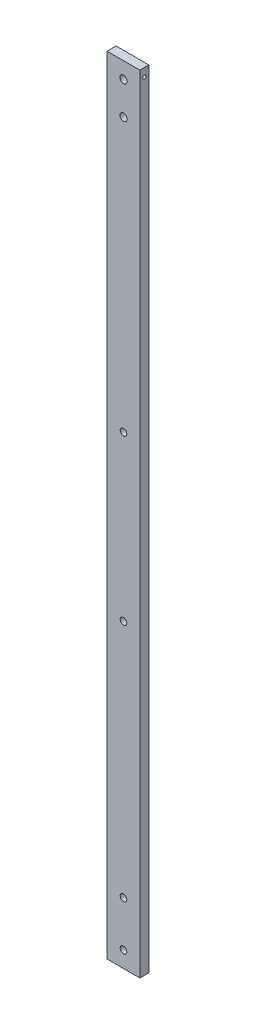
ISO-10303-21;
HEADER;
FILE_DESCRIPTION(('STEP AP214'),'2;1');
FILE_NAME('part.step','',(''),(''),'','','');
FILE_SCHEMA(('AUTOMOTIVE_DESIGN { 1 0 10303 214 1 1 1 1 }'));
ENDSEC;
DATA;
#1=APPLICATION_CONTEXT('core data for automotive mechanical design processes');
#2=APPLICATION_PROTOCOL_DEFINITION('international standard','automotive_design',2000,#1);
#3=PRODUCT_CONTEXT('',#1,'mechanical');
#4=PRODUCT('Part','Part','',(#3));
#5=PRODUCT_RELATED_PRODUCT_CATEGORY('part','',(#4));
#6=PRODUCT_DEFINITION_FORMATION('','',#4);
#7=PRODUCT_DEFINITION_CONTEXT('part definition',#1,'design');
#8=PRODUCT_DEFINITION('design','',#6,#7);
#9=PRODUCT_DEFINITION_SHAPE('','',#8);
#10=(LENGTH_UNIT() NAMED_UNIT(*) SI_UNIT(.MILLI.,.METRE.));
#11=(NAMED_UNIT(*) PLANE_ANGLE_UNIT() SI_UNIT($,.RADIAN.));
#12=(NAMED_UNIT(*) SI_UNIT($,.STERADIAN.) SOLID_ANGLE_UNIT());
#13=UNCERTAINTY_MEASURE_WITH_UNIT(LENGTH_MEASURE(1.E-05),#10,'distance_accuracy_value','');
#14=(GEOMETRIC_REPRESENTATION_CONTEXT(3) GLOBAL_UNCERTAINTY_ASSIGNED_CONTEXT((#13)) GLOBAL_UNIT_ASSIGNED_CONTEXT((#10,
#11,#12)) REPRESENTATION_CONTEXT('',''));
#15=CARTESIAN_POINT('',(0.,0.,0.));
#16=DIRECTION('',(0.,0.,1.));
#17=DIRECTION('',(1.,0.,0.));
#18=AXIS2_PLACEMENT_3D('',#15,#16,#17);
#19=CARTESIAN_POINT('',(0.,0.,7.));
#20=DIRECTION('',(0.,0.,-1.));
#21=DIRECTION('',(-1.,0.,0.));
#22=AXIS2_PLACEMENT_3D('',#19,#20,#21);
#23=PLANE('',#22);
#24=CARTESIAN_POINT('',(0.,55.4,7.));
#25=DIRECTION('',(0.,0.,-1.));
#26=DIRECTION('',(-1.,0.,0.));
#27=AXIS2_PLACEMENT_3D('',#24,#25,#26);
#28=CIRCLE('',#27,2.5527);
#29=CARTESIAN_POINT('',(-2.55270000000003,55.4,7.));
#30=VERTEX_POINT('',#29);
#31=EDGE_CURVE('E148',#30,#30,#28,.T.);
#32=ORIENTED_EDGE('',*,*,#31,.T.);
#33=EDGE_LOOP('',(#32));
#34=FACE_BOUND('',#33,.T.);
#35=CARTESIAN_POINT('',(0.,-71.6,7.));
#36=DIRECTION('',(0.,0.,-1.));
#37=DIRECTION('',(-1.,0.,0.));
#38=AXIS2_PLACEMENT_3D('',#35,#36,#37);
#39=CIRCLE('',#38,2.55270000000001);
#40=CARTESIAN_POINT('',(-2.55270000000001,-71.6,7.));
#41=VERTEX_POINT('',#40);
#42=EDGE_CURVE('E151',#41,#41,#39,.T.);
#43=ORIENTED_EDGE('',*,*,#42,.T.);
#44=EDGE_LOOP('',(#43));
#45=FACE_BOUND('',#44,.T.);
#46=DIRECTION('',(0.,1.,0.));
#47=VECTOR('',#46,1.);
#48=CARTESIAN_POINT('',(12.7000000000002,-304.800000000001,7.));
#49=LINE('',#48,#47);
#50=CARTESIAN_POINT('',(12.7000000000002,-304.800000000001,7.));
#51=VERTEX_POINT('',#50);
#52=CARTESIAN_POINT('',(12.7,304.799999999999,7.));
#53=VERTEX_POINT('',#52);
#54=EDGE_CURVE('E94',#51,#53,#49,.T.);
#55=ORIENTED_EDGE('',*,*,#54,.T.);
#56=DIRECTION('',(-1.,0.,0.));
#57=VECTOR('',#56,1.);
#58=CARTESIAN_POINT('',(-12.7,304.799999999999,7.));
#59=LINE('',#58,#57);
#60=CARTESIAN_POINT('',(-12.7,304.799999999999,7.));
#61=VERTEX_POINT('',#60);
#62=EDGE_CURVE('E89',#53,#61,#59,.T.);
#63=ORIENTED_EDGE('',*,*,#62,.T.);
#64=DIRECTION('',(0.,-1.,0.));
#65=VECTOR('',#64,1.);
#66=CARTESIAN_POINT('',(-12.7,-304.800000000001,7.));
#67=LINE('',#66,#65);
#68=CARTESIAN_POINT('',(-12.7,-304.800000000001,7.));
#69=VERTEX_POINT('',#68);
#70=EDGE_CURVE('E92',#61,#69,#67,.T.);
#71=ORIENTED_EDGE('',*,*,#70,.T.);
#72=DIRECTION('',(1.,0.,0.));
#73=VECTOR('',#72,1.);
#74=CARTESIAN_POINT('',(-12.7,-304.800000000001,7.));
#75=LINE('',#74,#73);
#76=EDGE_CURVE('E59',#69,#51,#75,.T.);
#77=ORIENTED_EDGE('',*,*,#76,.T.);
#78=EDGE_LOOP('',(#55,#63,#71,#77));
#79=FACE_BOUND('',#78,.T.);
#80=CARTESIAN_POINT('',(0.,-257.3,7.));
#81=DIRECTION('',(0.,0.,1.));
#82=DIRECTION('',(1.,0.,0.));
#83=AXIS2_PLACEMENT_3D('',#80,#81,#82);
#84=CIRCLE('',#83,2.55269999999999);
#85=CARTESIAN_POINT('',(2.55270000000007,-257.3,7.));
#86=VERTEX_POINT('',#85);
#87=EDGE_CURVE('E109',#86,#86,#84,.T.);
#88=ORIENTED_EDGE('',*,*,#87,.F.);
#89=EDGE_LOOP('',(#88));
#90=FACE_BOUND('',#89,.T.);
#91=CARTESIAN_POINT('',(0.,-292.3,7.));
#92=DIRECTION('',(0.,0.,1.));
#93=DIRECTION('',(1.,0.,0.));
#94=AXIS2_PLACEMENT_3D('',#91,#92,#93);
#95=CIRCLE('',#94,2.55269999999999);
#96=CARTESIAN_POINT('',(2.55270000000007,-292.3,7.));
#97=VERTEX_POINT('',#96);
#98=EDGE_CURVE('E124',#97,#97,#95,.T.);
#99=ORIENTED_EDGE('',*,*,#98,.F.);
#100=EDGE_LOOP('',(#99));
#101=FACE_BOUND('',#100,.T.);
#102=CARTESIAN_POINT('',(0.,292.2999996,7.));
#103=DIRECTION('',(0.,0.,1.));
#104=DIRECTION('',(1.,0.,0.));
#105=AXIS2_PLACEMENT_3D('',#102,#103,#104);
#106=CIRCLE('',#105,2.794);
#107=CARTESIAN_POINT('',(2.794,292.2999996,7.));
#108=VERTEX_POINT('',#107);
#109=EDGE_CURVE('E130',#108,#108,#106,.T.);
#110=ORIENTED_EDGE('',*,*,#109,.F.);
#111=EDGE_LOOP('',(#110));
#112=FACE_BOUND('',#111,.T.);
#113=CARTESIAN_POINT('',(0.,266.899999599999,7.));
#114=DIRECTION('',(0.,0.,1.));
#115=DIRECTION('',(1.,0.,0.));
#116=AXIS2_PLACEMENT_3D('',#113,#114,#115);
#117=CIRCLE('',#116,2.794);
#118=CARTESIAN_POINT('',(2.79400000000001,266.899999599999,7.));
#119=VERTEX_POINT('',#118);
#120=EDGE_CURVE('E136',#119,#119,#117,.T.);
#121=ORIENTED_EDGE('',*,*,#120,.F.);
#122=EDGE_LOOP('',(#121));
#123=FACE_BOUND('',#122,.T.);
#124=ADVANCED_FACE('F42',(#34,#45,#79,#90,#101,#112,#123),#23,.F.);
#125=CARTESIAN_POINT('',(0.,0.,0.));
#126=DIRECTION('',(0.,0.,-1.));
#127=DIRECTION('',(-1.,0.,0.));
#128=AXIS2_PLACEMENT_3D('',#125,#126,#127);
#129=PLANE('',#128);
#130=CARTESIAN_POINT('',(0.,55.4,0.));
#131=DIRECTION('',(0.,0.,-1.));
#132=DIRECTION('',(-1.,0.,0.));
#133=AXIS2_PLACEMENT_3D('',#130,#131,#132);
#134=CIRCLE('',#133,2.5527);
#135=CARTESIAN_POINT('',(-2.55270000000003,55.4,0.));
#136=VERTEX_POINT('',#135);
#137=EDGE_CURVE('E157',#136,#136,#134,.T.);
#138=ORIENTED_EDGE('',*,*,#137,.F.);
#139=EDGE_LOOP('',(#138));
#140=FACE_BOUND('',#139,.T.);
#141=CARTESIAN_POINT('',(0.,-71.6,0.));
#142=DIRECTION('',(0.,0.,-1.));
#143=DIRECTION('',(-1.,0.,0.));
#144=AXIS2_PLACEMENT_3D('',#141,#142,#143);
#145=CIRCLE('',#144,2.55270000000001);
#146=CARTESIAN_POINT('',(-2.55270000000001,-71.6,0.));
#147=VERTEX_POINT('',#146);
#148=EDGE_CURVE('E154',#147,#147,#145,.T.);
#149=ORIENTED_EDGE('',*,*,#148,.F.);
#150=EDGE_LOOP('',(#149));
#151=FACE_BOUND('',#150,.T.);
#152=CARTESIAN_POINT('',(0.,292.2999996,0.));
#153=DIRECTION('',(0.,0.,1.));
#154=DIRECTION('',(1.,0.,0.));
#155=AXIS2_PLACEMENT_3D('',#152,#153,#154);
#156=CIRCLE('',#155,2.794);
#157=CARTESIAN_POINT('',(2.794,292.2999996,0.));
#158=VERTEX_POINT('',#157);
#159=EDGE_CURVE('E133',#158,#158,#156,.T.);
#160=ORIENTED_EDGE('',*,*,#159,.T.);
#161=EDGE_LOOP('',(#160));
#162=FACE_BOUND('',#161,.T.);
#163=CARTESIAN_POINT('',(0.,-257.3,0.));
#164=DIRECTION('',(0.,0.,1.));
#165=DIRECTION('',(1.,0.,0.));
#166=AXIS2_PLACEMENT_3D('',#163,#164,#165);
#167=CIRCLE('',#166,2.55269999999999);
#168=CARTESIAN_POINT('',(2.55270000000007,-257.3,0.));
#169=VERTEX_POINT('',#168);
#170=EDGE_CURVE('E121',#169,#169,#167,.T.);
#171=ORIENTED_EDGE('',*,*,#170,.T.);
#172=EDGE_LOOP('',(#171));
#173=FACE_BOUND('',#172,.T.);
#174=DIRECTION('',(0.,1.,0.));
#175=VECTOR('',#174,1.);
#176=CARTESIAN_POINT('',(12.7000000000002,-304.800000000001,0.));
#177=LINE('',#176,#175);
#178=CARTESIAN_POINT('',(12.7000000000002,-304.800000000001,0.));
#179=VERTEX_POINT('',#178);
#180=CARTESIAN_POINT('',(12.7,304.799999999999,0.));
#181=VERTEX_POINT('',#180);
#182=EDGE_CURVE('E106',#179,#181,#177,.T.);
#183=ORIENTED_EDGE('',*,*,#182,.F.);
#184=DIRECTION('',(1.,0.,0.));
#185=VECTOR('',#184,1.);
#186=CARTESIAN_POINT('',(-12.7,-304.800000000001,0.));
#187=LINE('',#186,#185);
#188=CARTESIAN_POINT('',(-12.7,-304.800000000001,0.));
#189=VERTEX_POINT('',#188);
#190=EDGE_CURVE('E82',#189,#179,#187,.T.);
#191=ORIENTED_EDGE('',*,*,#190,.F.);
#192=DIRECTION('',(0.,-1.,0.));
#193=VECTOR('',#192,1.);
#194=CARTESIAN_POINT('',(-12.7,-304.800000000001,0.));
#195=LINE('',#194,#193);
#196=CARTESIAN_POINT('',(-12.7,304.799999999999,0.));
#197=VERTEX_POINT('',#196);
#198=EDGE_CURVE('E76',#197,#189,#195,.T.);
#199=ORIENTED_EDGE('',*,*,#198,.F.);
#200=DIRECTION('',(-1.,0.,0.));
#201=VECTOR('',#200,1.);
#202=CARTESIAN_POINT('',(-12.7,304.799999999999,0.));
#203=LINE('',#202,#201);
#204=EDGE_CURVE('E98',#181,#197,#203,.T.);
#205=ORIENTED_EDGE('',*,*,#204,.F.);
#206=EDGE_LOOP('',(#183,#191,#199,#205));
#207=FACE_BOUND('',#206,.T.);
#208=CARTESIAN_POINT('',(0.,-292.3,0.));
#209=DIRECTION('',(0.,0.,1.));
#210=DIRECTION('',(1.,0.,0.));
#211=AXIS2_PLACEMENT_3D('',#208,#209,#210);
#212=CIRCLE('',#211,2.55269999999999);
#213=CARTESIAN_POINT('',(2.55270000000007,-292.3,0.));
#214=VERTEX_POINT('',#213);
#215=EDGE_CURVE('E127',#214,#214,#212,.T.);
#216=ORIENTED_EDGE('',*,*,#215,.T.);
#217=EDGE_LOOP('',(#216));
#218=FACE_BOUND('',#217,.T.);
#219=CARTESIAN_POINT('',(0.,266.899999599999,0.));
#220=DIRECTION('',(0.,0.,1.));
#221=DIRECTION('',(1.,0.,0.));
#222=AXIS2_PLACEMENT_3D('',#219,#220,#221);
#223=CIRCLE('',#222,2.794);
#224=CARTESIAN_POINT('',(2.79400000000001,266.899999599999,0.));
#225=VERTEX_POINT('',#224);
#226=EDGE_CURVE('E139',#225,#225,#223,.T.);
#227=ORIENTED_EDGE('',*,*,#226,.T.);
#228=EDGE_LOOP('',(#227));
#229=FACE_BOUND('',#228,.T.);
#230=ADVANCED_FACE('F117',(#140,#151,#162,#173,#207,#218,#229),#129,.T.);
#231=CARTESIAN_POINT('',(12.7000000000002,-304.800000000001,7.));
#232=DIRECTION('',(-1.,0.,0.));
#233=DIRECTION('',(0.,-1.,0.));
#234=AXIS2_PLACEMENT_3D('',#231,#232,#233);
#235=PLANE('',#234);
#236=CARTESIAN_POINT('',(12.7000000000001,298.45,3.5));
#237=DIRECTION('',(1.,0.,0.));
#238=DIRECTION('',(0.,0.,-1.));
#239=AXIS2_PLACEMENT_3D('',#236,#237,#238);
#240=CIRCLE('',#239,1.33338172950043);
#241=CARTESIAN_POINT('',(12.7000000000001,298.45,2.16661827049957));
#242=VERTEX_POINT('',#241);
#243=EDGE_CURVE('E145',#242,#242,#240,.T.);
#244=ORIENTED_EDGE('',*,*,#243,.F.);
#245=EDGE_LOOP('',(#244));
#246=FACE_BOUND('',#245,.T.);
#247=ORIENTED_EDGE('',*,*,#182,.T.);
#248=DIRECTION('',(0.,0.,-1.));
#249=VECTOR('',#248,1.);
#250=CARTESIAN_POINT('',(12.7,304.799999999999,7.));
#251=LINE('',#250,#249);
#252=EDGE_CURVE('E12',#53,#181,#251,.T.);
#253=ORIENTED_EDGE('',*,*,#252,.F.);
#254=ORIENTED_EDGE('',*,*,#54,.F.);
#255=DIRECTION('',(0.,0.,-1.));
#256=VECTOR('',#255,1.);
#257=CARTESIAN_POINT('',(12.7000000000002,-304.800000000001,7.));
#258=LINE('',#257,#256);
#259=EDGE_CURVE('E102',#51,#179,#258,.T.);
#260=ORIENTED_EDGE('',*,*,#259,.T.);
#261=EDGE_LOOP('',(#247,#253,#254,#260));
#262=FACE_BOUND('',#261,.T.);
#263=ADVANCED_FACE('F44',(#246,#262),#235,.F.);
#264=CARTESIAN_POINT('',(-12.7,304.799999999999,7.));
#265=DIRECTION('',(0.,-1.,0.));
#266=DIRECTION('',(0.,0.,-1.));
#267=AXIS2_PLACEMENT_3D('',#264,#265,#266);
#268=PLANE('',#267);
#269=ORIENTED_EDGE('',*,*,#204,.T.);
#270=DIRECTION('',(0.,0.,-1.));
#271=VECTOR('',#270,1.);
#272=CARTESIAN_POINT('',(-12.7,304.799999999999,7.));
#273=LINE('',#272,#271);
#274=EDGE_CURVE('E51',#61,#197,#273,.T.);
#275=ORIENTED_EDGE('',*,*,#274,.F.);
#276=ORIENTED_EDGE('',*,*,#62,.F.);
#277=ORIENTED_EDGE('',*,*,#252,.T.);
#278=EDGE_LOOP('',(#269,#275,#276,#277));
#279=FACE_BOUND('',#278,.T.);
#280=ADVANCED_FACE('F97',(#279),#268,.F.);
#281=CARTESIAN_POINT('',(-12.7,-304.800000000001,7.));
#282=DIRECTION('',(1.,0.,0.));
#283=DIRECTION('',(0.,1.,0.));
#284=AXIS2_PLACEMENT_3D('',#281,#282,#283);
#285=PLANE('',#284);
#286=CARTESIAN_POINT('',(-12.7,298.45,3.5));
#287=DIRECTION('',(1.,0.,0.));
#288=DIRECTION('',(0.,0.,-1.));
#289=AXIS2_PLACEMENT_3D('',#286,#287,#288);
#290=CIRCLE('',#289,1.33338172950043);
#291=CARTESIAN_POINT('',(-12.7,298.45,2.16661827049957));
#292=VERTEX_POINT('',#291);
#293=EDGE_CURVE('E142',#292,#292,#290,.T.);
#294=ORIENTED_EDGE('',*,*,#293,.T.);
#295=EDGE_LOOP('',(#294));
#296=FACE_BOUND('',#295,.T.);
#297=ORIENTED_EDGE('',*,*,#198,.T.);
#298=DIRECTION('',(0.,0.,-1.));
#299=VECTOR('',#298,1.);
#300=CARTESIAN_POINT('',(-12.7,-304.800000000001,7.));
#301=LINE('',#300,#299);
#302=EDGE_CURVE('E99',#69,#189,#301,.T.);
#303=ORIENTED_EDGE('',*,*,#302,.F.);
#304=ORIENTED_EDGE('',*,*,#70,.F.);
#305=ORIENTED_EDGE('',*,*,#274,.T.);
#306=EDGE_LOOP('',(#297,#303,#304,#305));
#307=FACE_BOUND('',#306,.T.);
#308=ADVANCED_FACE('F100',(#296,#307),#285,.F.);
#309=CARTESIAN_POINT('',(-12.7,-304.800000000001,7.));
#310=DIRECTION('',(0.,1.,0.));
#311=DIRECTION('',(0.,0.,1.));
#312=AXIS2_PLACEMENT_3D('',#309,#310,#311);
#313=PLANE('',#312);
#314=ORIENTED_EDGE('',*,*,#190,.T.);
#315=ORIENTED_EDGE('',*,*,#259,.F.);
#316=ORIENTED_EDGE('',*,*,#76,.F.);
#317=ORIENTED_EDGE('',*,*,#302,.T.);
#318=EDGE_LOOP('',(#314,#315,#316,#317));
#319=FACE_BOUND('',#318,.T.);
#320=ADVANCED_FACE('F114',(#319),#313,.F.);
#321=CARTESIAN_POINT('',(0.,-257.3,7.));
#322=DIRECTION('',(0.,0.,-1.));
#323=DIRECTION('',(-1.,0.,0.));
#324=AXIS2_PLACEMENT_3D('',#321,#322,#323);
#325=CYLINDRICAL_SURFACE('',#324,2.55269999999999);
#326=ORIENTED_EDGE('',*,*,#87,.T.);
#327=EDGE_LOOP('',(#326));
#328=FACE_BOUND('',#327,.T.);
#329=ORIENTED_EDGE('',*,*,#170,.F.);
#330=EDGE_LOOP('',(#329));
#331=FACE_BOUND('',#330,.T.);
#332=ADVANCED_FACE('F181',(#328,#331),#325,.F.);
#333=CARTESIAN_POINT('',(0.,-292.3,7.));
#334=DIRECTION('',(0.,0.,-1.));
#335=DIRECTION('',(-1.,0.,0.));
#336=AXIS2_PLACEMENT_3D('',#333,#334,#335);
#337=CYLINDRICAL_SURFACE('',#336,2.55269999999999);
#338=ORIENTED_EDGE('',*,*,#98,.T.);
#339=EDGE_LOOP('',(#338));
#340=FACE_BOUND('',#339,.T.);
#341=ORIENTED_EDGE('',*,*,#215,.F.);
#342=EDGE_LOOP('',(#341));
#343=FACE_BOUND('',#342,.T.);
#344=ADVANCED_FACE('F183',(#340,#343),#337,.F.);
#345=CARTESIAN_POINT('',(0.,292.2999996,7.));
#346=DIRECTION('',(0.,0.,-1.));
#347=DIRECTION('',(-1.,0.,0.));
#348=AXIS2_PLACEMENT_3D('',#345,#346,#347);
#349=CYLINDRICAL_SURFACE('',#348,2.794);
#350=ORIENTED_EDGE('',*,*,#109,.T.);
#351=EDGE_LOOP('',(#350));
#352=FACE_BOUND('',#351,.T.);
#353=ORIENTED_EDGE('',*,*,#159,.F.);
#354=EDGE_LOOP('',(#353));
#355=FACE_BOUND('',#354,.T.);
#356=ADVANCED_FACE('F190',(#352,#355),#349,.F.);
#357=CARTESIAN_POINT('',(0.,266.899999599999,7.));
#358=DIRECTION('',(0.,0.,-1.));
#359=DIRECTION('',(-1.,0.,0.));
#360=AXIS2_PLACEMENT_3D('',#357,#358,#359);
#361=CYLINDRICAL_SURFACE('',#360,2.794);
#362=ORIENTED_EDGE('',*,*,#120,.T.);
#363=EDGE_LOOP('',(#362));
#364=FACE_BOUND('',#363,.T.);
#365=ORIENTED_EDGE('',*,*,#226,.F.);
#366=EDGE_LOOP('',(#365));
#367=FACE_BOUND('',#366,.T.);
#368=ADVANCED_FACE('F212',(#364,#367),#361,.F.);
#369=CARTESIAN_POINT('',(-12.7,298.45,3.5));
#370=DIRECTION('',(1.,0.,0.));
#371=DIRECTION('',(0.,0.,-1.));
#372=AXIS2_PLACEMENT_3D('',#369,#370,#371);
#373=CYLINDRICAL_SURFACE('',#372,1.33338172950043);
#374=ORIENTED_EDGE('',*,*,#293,.F.);
#375=EDGE_LOOP('',(#374));
#376=FACE_BOUND('',#375,.T.);
#377=ORIENTED_EDGE('',*,*,#243,.T.);
#378=EDGE_LOOP('',(#377));
#379=FACE_BOUND('',#378,.T.);
#380=ADVANCED_FACE('F210',(#376,#379),#373,.F.);
#381=CARTESIAN_POINT('',(0.,-71.6,7.));
#382=DIRECTION('',(0.,0.,-1.));
#383=DIRECTION('',(-1.,0.,0.));
#384=AXIS2_PLACEMENT_3D('',#381,#382,#383);
#385=CYLINDRICAL_SURFACE('',#384,2.55270000000001);
#386=ORIENTED_EDGE('',*,*,#42,.F.);
#387=EDGE_LOOP('',(#386));
#388=FACE_BOUND('',#387,.T.);
#389=ORIENTED_EDGE('',*,*,#148,.T.);
#390=EDGE_LOOP('',(#389));
#391=FACE_BOUND('',#390,.T.);
#392=ADVANCED_FACE('F168',(#388,#391),#385,.F.);
#393=CARTESIAN_POINT('',(0.,55.4,7.));
#394=DIRECTION('',(0.,0.,-1.));
#395=DIRECTION('',(-1.,0.,0.));
#396=AXIS2_PLACEMENT_3D('',#393,#394,#395);
#397=CYLINDRICAL_SURFACE('',#396,2.5527);
#398=ORIENTED_EDGE('',*,*,#31,.F.);
#399=EDGE_LOOP('',(#398));
#400=FACE_BOUND('',#399,.T.);
#401=ORIENTED_EDGE('',*,*,#137,.T.);
#402=EDGE_LOOP('',(#401));
#403=FACE_BOUND('',#402,.T.);
#404=ADVANCED_FACE('F165',(#400,#403),#397,.F.);
#405=CLOSED_SHELL('',(#124,#230,#263,#280,#308,#320,#332,#344,#356,#368,#380,#392,#404));
#406=MANIFOLD_SOLID_BREP('B2',#405);
#407=ADVANCED_BREP_SHAPE_REPRESENTATION('',(#18,#406),#14);
#408=SHAPE_DEFINITION_REPRESENTATION(#9,#407);
ENDSEC;
END-ISO-10303-21;
